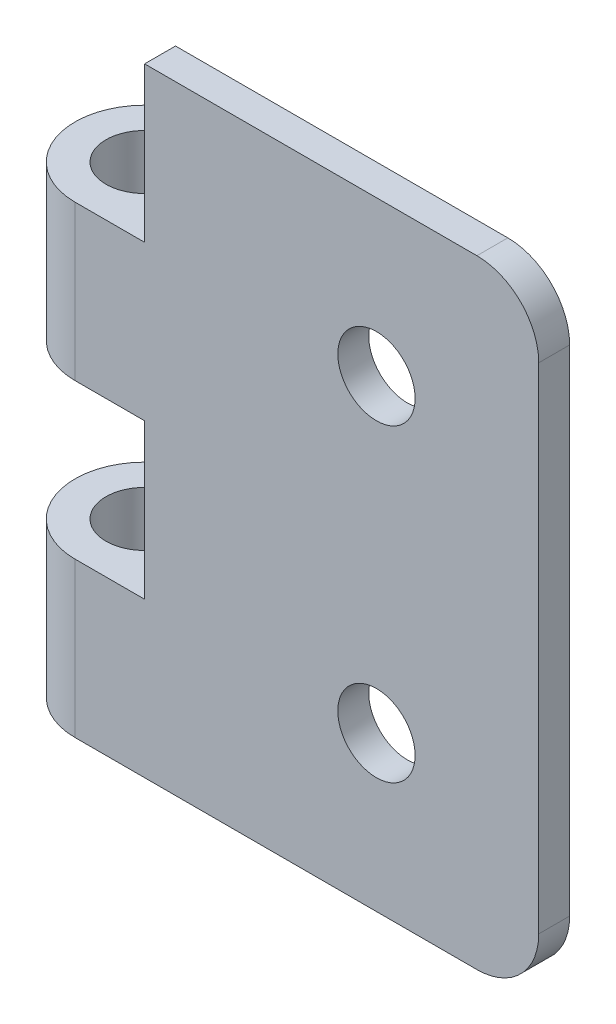
ISO-10303-21;
HEADER;
FILE_DESCRIPTION(('STEP AP214'),'2;1');
FILE_NAME('part.step','',(''),(''),'','','');
FILE_SCHEMA(('AUTOMOTIVE_DESIGN { 1 0 10303 214 1 1 1 1 }'));
ENDSEC;
DATA;
#1=APPLICATION_CONTEXT('core data for automotive mechanical design processes');
#2=APPLICATION_PROTOCOL_DEFINITION('international standard','automotive_design',2000,#1);
#3=PRODUCT_CONTEXT('',#1,'mechanical');
#4=PRODUCT('Part','Part','',(#3));
#5=PRODUCT_RELATED_PRODUCT_CATEGORY('part','',(#4));
#6=PRODUCT_DEFINITION_FORMATION('','',#4);
#7=PRODUCT_DEFINITION_CONTEXT('part definition',#1,'design');
#8=PRODUCT_DEFINITION('design','',#6,#7);
#9=PRODUCT_DEFINITION_SHAPE('','',#8);
#10=(LENGTH_UNIT() NAMED_UNIT(*) SI_UNIT(.MILLI.,.METRE.));
#11=(NAMED_UNIT(*) PLANE_ANGLE_UNIT() SI_UNIT($,.RADIAN.));
#12=(NAMED_UNIT(*) SI_UNIT($,.STERADIAN.) SOLID_ANGLE_UNIT());
#13=UNCERTAINTY_MEASURE_WITH_UNIT(LENGTH_MEASURE(1.E-05),#10,'distance_accuracy_value','');
#14=(GEOMETRIC_REPRESENTATION_CONTEXT(3) GLOBAL_UNCERTAINTY_ASSIGNED_CONTEXT((#13)) GLOBAL_UNIT_ASSIGNED_CONTEXT((#10,
#11,#12)) REPRESENTATION_CONTEXT('',''));
#15=CARTESIAN_POINT('',(0.,0.,0.));
#16=DIRECTION('',(0.,0.,1.));
#17=DIRECTION('',(1.,0.,0.));
#18=AXIS2_PLACEMENT_3D('',#15,#16,#17);
#19=CARTESIAN_POINT('',(0.,40.,0.));
#20=DIRECTION('',(0.,-1.,0.));
#21=DIRECTION('',(0.,0.,-1.));
#22=AXIS2_PLACEMENT_3D('',#19,#20,#21);
#23=CYLINDRICAL_SURFACE('',#22,4.5);
#24=CARTESIAN_POINT('',(0.,30.,0.));
#25=DIRECTION('',(0.,-1.,0.));
#26=DIRECTION('',(0.,0.,-1.));
#27=AXIS2_PLACEMENT_3D('',#24,#25,#26);
#28=CIRCLE('',#27,4.5);
#29=CARTESIAN_POINT('',(0.,30.,4.5));
#30=VERTEX_POINT('',#29);
#31=CARTESIAN_POINT('',(3.74165738677394,30.,2.5));
#32=VERTEX_POINT('',#31);
#33=EDGE_CURVE('E156',#30,#32,#28,.T.);
#34=ORIENTED_EDGE('',*,*,#33,.T.);
#35=DIRECTION('',(0.,-1.,0.));
#36=VECTOR('',#35,1.);
#37=CARTESIAN_POINT('',(3.74165738677394,40.,2.5));
#38=LINE('',#37,#36);
#39=CARTESIAN_POINT('',(3.74165738677394,20.,2.5));
#40=VERTEX_POINT('',#39);
#41=EDGE_CURVE('E189',#32,#40,#38,.T.);
#42=ORIENTED_EDGE('',*,*,#41,.T.);
#43=CARTESIAN_POINT('',(0.,20.,0.));
#44=DIRECTION('',(0.,1.,0.));
#45=DIRECTION('',(0.,0.,1.));
#46=AXIS2_PLACEMENT_3D('',#43,#44,#45);
#47=CIRCLE('',#46,4.5);
#48=CARTESIAN_POINT('',(0.,20.,4.5));
#49=VERTEX_POINT('',#48);
#50=EDGE_CURVE('E256',#40,#49,#47,.T.);
#51=ORIENTED_EDGE('',*,*,#50,.T.);
#52=DIRECTION('',(0.,-1.,0.));
#53=VECTOR('',#52,1.);
#54=CARTESIAN_POINT('',(0.,40.,4.5));
#55=LINE('',#54,#53);
#56=EDGE_CURVE('E197',#30,#49,#55,.T.);
#57=ORIENTED_EDGE('',*,*,#56,.F.);
#58=EDGE_LOOP('',(#34,#42,#51,#57));
#59=FACE_BOUND('',#58,.T.);
#60=ADVANCED_FACE('F35',(#59),#23,.T.);
#61=CARTESIAN_POINT('',(0.,40.,0.));
#62=DIRECTION('',(0.,1.,0.));
#63=DIRECTION('',(0.,0.,1.));
#64=AXIS2_PLACEMENT_3D('',#61,#62,#63);
#65=PLANE('',#64);
#66=DIRECTION('',(1.,0.,0.));
#67=VECTOR('',#66,1.);
#68=CARTESIAN_POINT('',(0.,40.,4.5));
#69=LINE('',#68,#67);
#70=CARTESIAN_POINT('',(4.5,40.,4.5));
#71=VERTEX_POINT('',#70);
#72=CARTESIAN_POINT('',(26.,40.,4.5));
#73=VERTEX_POINT('',#72);
#74=EDGE_CURVE('E175',#71,#73,#69,.T.);
#75=ORIENTED_EDGE('',*,*,#74,.T.);
#76=DIRECTION('',(0.,0.,-1.));
#77=VECTOR('',#76,1.);
#78=CARTESIAN_POINT('',(26.,40.,2.5));
#79=LINE('',#78,#77);
#80=CARTESIAN_POINT('',(26.,40.,2.5));
#81=VERTEX_POINT('',#80);
#82=EDGE_CURVE('E214',#73,#81,#79,.T.);
#83=ORIENTED_EDGE('',*,*,#82,.T.);
#84=DIRECTION('',(-1.,0.,0.));
#85=VECTOR('',#84,1.);
#86=CARTESIAN_POINT('',(30.,40.,2.5));
#87=LINE('',#86,#85);
#88=CARTESIAN_POINT('',(4.5,40.,2.5));
#89=VERTEX_POINT('',#88);
#90=EDGE_CURVE('E178',#81,#89,#87,.T.);
#91=ORIENTED_EDGE('',*,*,#90,.T.);
#92=DIRECTION('',(0.,0.,-1.));
#93=VECTOR('',#92,1.);
#94=CARTESIAN_POINT('',(4.5,40.,22.5));
#95=LINE('',#94,#93);
#96=EDGE_CURVE('E202',#71,#89,#95,.T.);
#97=ORIENTED_EDGE('',*,*,#96,.F.);
#98=EDGE_LOOP('',(#75,#83,#91,#97));
#99=FACE_BOUND('',#98,.T.);
#100=ADVANCED_FACE('F233',(#99),#65,.T.);
#101=CARTESIAN_POINT('',(0.,0.,0.));
#102=DIRECTION('',(0.,1.,0.));
#103=DIRECTION('',(0.,0.,1.));
#104=AXIS2_PLACEMENT_3D('',#101,#102,#103);
#105=PLANE('',#104);
#106=DIRECTION('',(-1.,0.,0.));
#107=VECTOR('',#106,1.);
#108=CARTESIAN_POINT('',(30.,0.,2.5));
#109=LINE('',#108,#107);
#110=CARTESIAN_POINT('',(26.,0.,2.5));
#111=VERTEX_POINT('',#110);
#112=CARTESIAN_POINT('',(3.74165738677394,0.,2.5));
#113=VERTEX_POINT('',#112);
#114=EDGE_CURVE('E179',#111,#113,#109,.T.);
#115=ORIENTED_EDGE('',*,*,#114,.F.);
#116=DIRECTION('',(0.,0.,-1.));
#117=VECTOR('',#116,1.);
#118=CARTESIAN_POINT('',(26.,0.,0.));
#119=LINE('',#118,#117);
#120=CARTESIAN_POINT('',(26.,0.,4.5));
#121=VERTEX_POINT('',#120);
#122=EDGE_CURVE('E11',#111,#121,#119,.F.);
#123=ORIENTED_EDGE('',*,*,#122,.T.);
#124=DIRECTION('',(1.,0.,0.));
#125=VECTOR('',#124,1.);
#126=CARTESIAN_POINT('',(0.,0.,4.5));
#127=LINE('',#126,#125);
#128=CARTESIAN_POINT('',(0.,0.,4.5));
#129=VERTEX_POINT('',#128);
#130=EDGE_CURVE('E184',#129,#121,#127,.T.);
#131=ORIENTED_EDGE('',*,*,#130,.F.);
#132=CARTESIAN_POINT('',(0.,0.,0.));
#133=DIRECTION('',(0.,1.,0.));
#134=DIRECTION('',(0.,0.,1.));
#135=AXIS2_PLACEMENT_3D('',#132,#133,#134);
#136=CIRCLE('',#135,4.5);
#137=EDGE_CURVE('E174',#113,#129,#136,.T.);
#138=ORIENTED_EDGE('',*,*,#137,.F.);
#139=EDGE_LOOP('',(#115,#123,#131,#138));
#140=FACE_BOUND('',#139,.T.);
#141=CARTESIAN_POINT('',(0.,0.,0.));
#142=DIRECTION('',(0.,1.,0.));
#143=DIRECTION('',(0.,0.,1.));
#144=AXIS2_PLACEMENT_3D('',#141,#142,#143);
#145=CIRCLE('',#144,2.5);
#146=CARTESIAN_POINT('',(0.,0.,2.5));
#147=VERTEX_POINT('',#146);
#148=EDGE_CURVE('E167',#147,#147,#145,.T.);
#149=ORIENTED_EDGE('',*,*,#148,.T.);
#150=EDGE_LOOP('',(#149));
#151=FACE_BOUND('',#150,.T.);
#152=ADVANCED_FACE('F246',(#140,#151),#105,.F.);
#153=CARTESIAN_POINT('',(0.,10.,0.));
#154=DIRECTION('',(0.,-1.,0.));
#155=DIRECTION('',(1.,0.,0.));
#156=AXIS2_PLACEMENT_3D('',#153,#154,#155);
#157=CIRCLE('',#156,4.5);
#158=CARTESIAN_POINT('',(0.,10.,4.5));
#159=VERTEX_POINT('',#158);
#160=CARTESIAN_POINT('',(3.74165738677394,10.,2.5));
#161=VERTEX_POINT('',#160);
#162=EDGE_CURVE('E130',#159,#161,#157,.T.);
#163=ORIENTED_EDGE('',*,*,#162,.T.);
#164=EDGE_CURVE('E181',#161,#113,#38,.T.);
#165=ORIENTED_EDGE('',*,*,#164,.T.);
#166=ORIENTED_EDGE('',*,*,#137,.T.);
#167=EDGE_CURVE('E195',#159,#129,#55,.T.);
#168=ORIENTED_EDGE('',*,*,#167,.F.);
#169=EDGE_LOOP('',(#163,#165,#166,#168));
#170=FACE_BOUND('',#169,.T.);
#171=ADVANCED_FACE('F249',(#170),#23,.T.);
#172=CARTESIAN_POINT('',(0.,40.,4.5));
#173=DIRECTION('',(0.,0.,-1.));
#174=DIRECTION('',(-1.,0.,0.));
#175=AXIS2_PLACEMENT_3D('',#172,#173,#174);
#176=PLANE('',#175);
#177=CARTESIAN_POINT('',(19.5,30.,4.5));
#178=DIRECTION('',(0.,0.,1.));
#179=DIRECTION('',(1.,0.,0.));
#180=AXIS2_PLACEMENT_3D('',#177,#178,#179);
#181=CIRCLE('',#180,2.5);
#182=CARTESIAN_POINT('',(22.,30.,4.5));
#183=VERTEX_POINT('',#182);
#184=EDGE_CURVE('E160',#183,#183,#181,.T.);
#185=ORIENTED_EDGE('',*,*,#184,.F.);
#186=EDGE_LOOP('',(#185));
#187=FACE_BOUND('',#186,.T.);
#188=CARTESIAN_POINT('',(19.5,10.,4.5));
#189=DIRECTION('',(0.,0.,1.));
#190=DIRECTION('',(-1.,0.,0.));
#191=AXIS2_PLACEMENT_3D('',#188,#189,#190);
#192=CIRCLE('',#191,2.5);
#193=CARTESIAN_POINT('',(17.,10.,4.5));
#194=VERTEX_POINT('',#193);
#195=EDGE_CURVE('E153',#194,#194,#192,.T.);
#196=ORIENTED_EDGE('',*,*,#195,.F.);
#197=EDGE_LOOP('',(#196));
#198=FACE_BOUND('',#197,.T.);
#199=DIRECTION('',(0.,-1.,0.));
#200=VECTOR('',#199,1.);
#201=CARTESIAN_POINT('',(30.,40.,4.5));
#202=LINE('',#201,#200);
#203=CARTESIAN_POINT('',(30.,36.,4.5));
#204=VERTEX_POINT('',#203);
#205=CARTESIAN_POINT('',(30.,4.,4.5));
#206=VERTEX_POINT('',#205);
#207=EDGE_CURVE('E193',#204,#206,#202,.T.);
#208=ORIENTED_EDGE('',*,*,#207,.F.);
#209=CARTESIAN_POINT('',(26.,36.,4.5));
#210=DIRECTION('',(0.,0.,-1.));
#211=DIRECTION('',(-1.,0.,0.));
#212=AXIS2_PLACEMENT_3D('',#209,#210,#211);
#213=CIRCLE('',#212,4.);
#214=EDGE_CURVE('E43',#204,#73,#213,.F.);
#215=ORIENTED_EDGE('',*,*,#214,.T.);
#216=ORIENTED_EDGE('',*,*,#74,.F.);
#217=DIRECTION('',(0.,-1.,0.));
#218=VECTOR('',#217,1.);
#219=CARTESIAN_POINT('',(4.5,40.,4.5));
#220=LINE('',#219,#218);
#221=CARTESIAN_POINT('',(4.5,30.,4.5));
#222=VERTEX_POINT('',#221);
#223=EDGE_CURVE('E149',#71,#222,#220,.T.);
#224=ORIENTED_EDGE('',*,*,#223,.T.);
#225=DIRECTION('',(-1.,0.,0.));
#226=VECTOR('',#225,1.);
#227=CARTESIAN_POINT('',(0.,30.,4.5));
#228=LINE('',#227,#226);
#229=EDGE_CURVE('E150',#222,#30,#228,.T.);
#230=ORIENTED_EDGE('',*,*,#229,.T.);
#231=ORIENTED_EDGE('',*,*,#56,.T.);
#232=DIRECTION('',(1.,0.,0.));
#233=VECTOR('',#232,1.);
#234=CARTESIAN_POINT('',(0.,20.,4.5));
#235=LINE('',#234,#233);
#236=CARTESIAN_POINT('',(4.5,20.,4.5));
#237=VERTEX_POINT('',#236);
#238=EDGE_CURVE('E148',#49,#237,#235,.T.);
#239=ORIENTED_EDGE('',*,*,#238,.T.);
#240=DIRECTION('',(0.,-1.,0.));
#241=VECTOR('',#240,1.);
#242=CARTESIAN_POINT('',(4.5,40.,4.5));
#243=LINE('',#242,#241);
#244=CARTESIAN_POINT('',(4.5,10.,4.5));
#245=VERTEX_POINT('',#244);
#246=EDGE_CURVE('E138',#237,#245,#243,.T.);
#247=ORIENTED_EDGE('',*,*,#246,.T.);
#248=DIRECTION('',(-1.,0.,0.));
#249=VECTOR('',#248,1.);
#250=CARTESIAN_POINT('',(0.,10.,4.5));
#251=LINE('',#250,#249);
#252=EDGE_CURVE('E124',#245,#159,#251,.T.);
#253=ORIENTED_EDGE('',*,*,#252,.T.);
#254=ORIENTED_EDGE('',*,*,#167,.T.);
#255=ORIENTED_EDGE('',*,*,#130,.T.);
#256=CARTESIAN_POINT('',(26.,4.,4.5));
#257=DIRECTION('',(0.,0.,-1.));
#258=DIRECTION('',(-1.,0.,0.));
#259=AXIS2_PLACEMENT_3D('',#256,#257,#258);
#260=CIRCLE('',#259,4.);
#261=EDGE_CURVE('E55',#121,#206,#260,.F.);
#262=ORIENTED_EDGE('',*,*,#261,.T.);
#263=EDGE_LOOP('',(#208,#215,#216,#224,#230,#231,#239,#247,#253,#254,#255,#262));
#264=FACE_BOUND('',#263,.T.);
#265=ADVANCED_FACE('F146',(#187,#198,#264),#176,.F.);
#266=CARTESIAN_POINT('',(30.,40.,4.5));
#267=DIRECTION('',(-1.,0.,0.));
#268=DIRECTION('',(0.,0.,1.));
#269=AXIS2_PLACEMENT_3D('',#266,#267,#268);
#270=PLANE('',#269);
#271=DIRECTION('',(0.,-1.,0.));
#272=VECTOR('',#271,1.);
#273=CARTESIAN_POINT('',(30.,40.,2.5));
#274=LINE('',#273,#272);
#275=CARTESIAN_POINT('',(30.,36.,2.5));
#276=VERTEX_POINT('',#275);
#277=CARTESIAN_POINT('',(30.,4.,2.5));
#278=VERTEX_POINT('',#277);
#279=EDGE_CURVE('E190',#276,#278,#274,.T.);
#280=ORIENTED_EDGE('',*,*,#279,.F.);
#281=DIRECTION('',(0.,0.,-1.));
#282=VECTOR('',#281,1.);
#283=CARTESIAN_POINT('',(30.,36.,4.5));
#284=LINE('',#283,#282);
#285=EDGE_CURVE('E224',#276,#204,#284,.F.);
#286=ORIENTED_EDGE('',*,*,#285,.T.);
#287=ORIENTED_EDGE('',*,*,#207,.T.);
#288=DIRECTION('',(0.,0.,-1.));
#289=VECTOR('',#288,1.);
#290=CARTESIAN_POINT('',(30.,4.,4.5));
#291=LINE('',#290,#289);
#292=EDGE_CURVE('E221',#206,#278,#291,.T.);
#293=ORIENTED_EDGE('',*,*,#292,.T.);
#294=EDGE_LOOP('',(#280,#286,#287,#293));
#295=FACE_BOUND('',#294,.T.);
#296=ADVANCED_FACE('F241',(#295),#270,.F.);
#297=CARTESIAN_POINT('',(30.,40.,2.5));
#298=DIRECTION('',(0.,0.,1.));
#299=DIRECTION('',(1.,0.,0.));
#300=AXIS2_PLACEMENT_3D('',#297,#298,#299);
#301=PLANE('',#300);
#302=CARTESIAN_POINT('',(19.5,30.,2.5));
#303=DIRECTION('',(0.,0.,1.));
#304=DIRECTION('',(1.,0.,0.));
#305=AXIS2_PLACEMENT_3D('',#302,#303,#304);
#306=CIRCLE('',#305,2.5);
#307=CARTESIAN_POINT('',(22.,30.,2.5));
#308=VERTEX_POINT('',#307);
#309=EDGE_CURVE('E163',#308,#308,#306,.F.);
#310=ORIENTED_EDGE('',*,*,#309,.F.);
#311=EDGE_LOOP('',(#310));
#312=FACE_BOUND('',#311,.T.);
#313=CARTESIAN_POINT('',(19.5,10.,2.5));
#314=DIRECTION('',(0.,0.,1.));
#315=DIRECTION('',(1.,0.,0.));
#316=AXIS2_PLACEMENT_3D('',#313,#314,#315);
#317=CIRCLE('',#316,2.5);
#318=CARTESIAN_POINT('',(22.,10.,2.5));
#319=VERTEX_POINT('',#318);
#320=EDGE_CURVE('E164',#319,#319,#317,.F.);
#321=ORIENTED_EDGE('',*,*,#320,.F.);
#322=EDGE_LOOP('',(#321));
#323=FACE_BOUND('',#322,.T.);
#324=ORIENTED_EDGE('',*,*,#90,.F.);
#325=CARTESIAN_POINT('',(26.,36.,2.5));
#326=DIRECTION('',(0.,0.,1.));
#327=DIRECTION('',(1.,0.,0.));
#328=AXIS2_PLACEMENT_3D('',#325,#326,#327);
#329=CIRCLE('',#328,4.);
#330=EDGE_CURVE('E219',#81,#276,#329,.F.);
#331=ORIENTED_EDGE('',*,*,#330,.T.);
#332=ORIENTED_EDGE('',*,*,#279,.T.);
#333=CARTESIAN_POINT('',(26.,4.,2.5));
#334=DIRECTION('',(0.,0.,1.));
#335=DIRECTION('',(1.,0.,0.));
#336=AXIS2_PLACEMENT_3D('',#333,#334,#335);
#337=CIRCLE('',#336,4.);
#338=EDGE_CURVE('E217',#278,#111,#337,.F.);
#339=ORIENTED_EDGE('',*,*,#338,.T.);
#340=ORIENTED_EDGE('',*,*,#114,.T.);
#341=ORIENTED_EDGE('',*,*,#164,.F.);
#342=DIRECTION('',(1.,0.,0.));
#343=VECTOR('',#342,1.);
#344=CARTESIAN_POINT('',(30.,10.,2.5));
#345=LINE('',#344,#343);
#346=CARTESIAN_POINT('',(4.5,10.,2.5));
#347=VERTEX_POINT('',#346);
#348=EDGE_CURVE('E201',#161,#347,#345,.T.);
#349=ORIENTED_EDGE('',*,*,#348,.T.);
#350=DIRECTION('',(0.,1.,0.));
#351=VECTOR('',#350,1.);
#352=CARTESIAN_POINT('',(4.5,40.,2.5));
#353=LINE('',#352,#351);
#354=CARTESIAN_POINT('',(4.5,20.,2.5));
#355=VERTEX_POINT('',#354);
#356=EDGE_CURVE('E141',#347,#355,#353,.T.);
#357=ORIENTED_EDGE('',*,*,#356,.T.);
#358=DIRECTION('',(-1.,0.,0.));
#359=VECTOR('',#358,1.);
#360=CARTESIAN_POINT('',(30.,20.,2.5));
#361=LINE('',#360,#359);
#362=EDGE_CURVE('E205',#355,#40,#361,.T.);
#363=ORIENTED_EDGE('',*,*,#362,.T.);
#364=ORIENTED_EDGE('',*,*,#41,.F.);
#365=DIRECTION('',(1.,0.,0.));
#366=VECTOR('',#365,1.);
#367=CARTESIAN_POINT('',(30.,30.,2.5));
#368=LINE('',#367,#366);
#369=CARTESIAN_POINT('',(4.5,30.,2.5));
#370=VERTEX_POINT('',#369);
#371=EDGE_CURVE('E209',#32,#370,#368,.T.);
#372=ORIENTED_EDGE('',*,*,#371,.T.);
#373=DIRECTION('',(0.,1.,0.));
#374=VECTOR('',#373,1.);
#375=CARTESIAN_POINT('',(4.5,40.,2.5));
#376=LINE('',#375,#374);
#377=EDGE_CURVE('E211',#370,#89,#376,.T.);
#378=ORIENTED_EDGE('',*,*,#377,.T.);
#379=EDGE_LOOP('',(#324,#331,#332,#339,#340,#341,#349,#357,#363,#364,#372,#378));
#380=FACE_BOUND('',#379,.T.);
#381=ADVANCED_FACE('F239',(#312,#323,#380),#301,.F.);
#382=CARTESIAN_POINT('',(0.,40.,0.));
#383=DIRECTION('',(0.,-1.,0.));
#384=DIRECTION('',(0.,0.,-1.));
#385=AXIS2_PLACEMENT_3D('',#382,#383,#384);
#386=CYLINDRICAL_SURFACE('',#385,2.5);
#387=CARTESIAN_POINT('',(0.,10.,0.));
#388=DIRECTION('',(0.,-1.,0.));
#389=DIRECTION('',(1.,0.,0.));
#390=AXIS2_PLACEMENT_3D('',#387,#388,#389);
#391=CIRCLE('',#390,2.5);
#392=CARTESIAN_POINT('',(2.5,10.,0.));
#393=VERTEX_POINT('',#392);
#394=EDGE_CURVE('E198',#393,#393,#391,.T.);
#395=ORIENTED_EDGE('',*,*,#394,.F.);
#396=EDGE_LOOP('',(#395));
#397=FACE_BOUND('',#396,.T.);
#398=ORIENTED_EDGE('',*,*,#148,.F.);
#399=EDGE_LOOP('',(#398));
#400=FACE_BOUND('',#399,.T.);
#401=ADVANCED_FACE('F288',(#397,#400),#386,.F.);
#402=CARTESIAN_POINT('',(19.5,10.,-4.501));
#403=DIRECTION('',(0.,0.,1.));
#404=DIRECTION('',(1.,0.,0.));
#405=AXIS2_PLACEMENT_3D('',#402,#403,#404);
#406=CYLINDRICAL_SURFACE('',#405,2.5);
#407=ORIENTED_EDGE('',*,*,#195,.T.);
#408=EDGE_LOOP('',(#407));
#409=FACE_BOUND('',#408,.T.);
#410=ORIENTED_EDGE('',*,*,#320,.T.);
#411=EDGE_LOOP('',(#410));
#412=FACE_BOUND('',#411,.T.);
#413=ADVANCED_FACE('F326',(#409,#412),#406,.F.);
#414=CARTESIAN_POINT('',(19.5,30.,-4.501));
#415=DIRECTION('',(0.,0.,1.));
#416=DIRECTION('',(1.,0.,0.));
#417=AXIS2_PLACEMENT_3D('',#414,#415,#416);
#418=CYLINDRICAL_SURFACE('',#417,2.5);
#419=ORIENTED_EDGE('',*,*,#184,.T.);
#420=EDGE_LOOP('',(#419));
#421=FACE_BOUND('',#420,.T.);
#422=ORIENTED_EDGE('',*,*,#309,.T.);
#423=EDGE_LOOP('',(#422));
#424=FACE_BOUND('',#423,.T.);
#425=ADVANCED_FACE('F334',(#421,#424),#418,.F.);
#426=CARTESIAN_POINT('',(4.5,20.,22.5));
#427=DIRECTION('',(1.,0.,0.));
#428=DIRECTION('',(0.,1.,0.));
#429=AXIS2_PLACEMENT_3D('',#426,#427,#428);
#430=PLANE('',#429);
#431=DIRECTION('',(0.,0.,-1.));
#432=VECTOR('',#431,1.);
#433=CARTESIAN_POINT('',(4.5,20.,22.5));
#434=LINE('',#433,#432);
#435=EDGE_CURVE('E143',#237,#355,#434,.T.);
#436=ORIENTED_EDGE('',*,*,#435,.T.);
#437=ORIENTED_EDGE('',*,*,#356,.F.);
#438=DIRECTION('',(0.,0.,-1.));
#439=VECTOR('',#438,1.);
#440=CARTESIAN_POINT('',(4.5,10.,22.5));
#441=LINE('',#440,#439);
#442=EDGE_CURVE('E128',#245,#347,#441,.T.);
#443=ORIENTED_EDGE('',*,*,#442,.F.);
#444=ORIENTED_EDGE('',*,*,#246,.F.);
#445=EDGE_LOOP('',(#436,#437,#443,#444));
#446=FACE_BOUND('',#445,.T.);
#447=ADVANCED_FACE('F137',(#446),#430,.F.);
#448=CARTESIAN_POINT('',(4.5,20.,22.5));
#449=DIRECTION('',(0.,1.,0.));
#450=DIRECTION('',(0.,0.,1.));
#451=AXIS2_PLACEMENT_3D('',#448,#449,#450);
#452=PLANE('',#451);
#453=CARTESIAN_POINT('',(0.,20.,0.));
#454=DIRECTION('',(0.,1.,0.));
#455=DIRECTION('',(0.,0.,1.));
#456=AXIS2_PLACEMENT_3D('',#453,#454,#455);
#457=CIRCLE('',#456,2.5);
#458=CARTESIAN_POINT('',(0.,20.,2.5));
#459=VERTEX_POINT('',#458);
#460=EDGE_CURVE('E133',#459,#459,#457,.T.);
#461=ORIENTED_EDGE('',*,*,#460,.T.);
#462=EDGE_LOOP('',(#461));
#463=FACE_BOUND('',#462,.T.);
#464=ORIENTED_EDGE('',*,*,#50,.F.);
#465=ORIENTED_EDGE('',*,*,#362,.F.);
#466=ORIENTED_EDGE('',*,*,#435,.F.);
#467=ORIENTED_EDGE('',*,*,#238,.F.);
#468=EDGE_LOOP('',(#464,#465,#466,#467));
#469=FACE_BOUND('',#468,.T.);
#470=ADVANCED_FACE('F272',(#463,#469),#452,.F.);
#471=CARTESIAN_POINT('',(4.5,10.,22.5));
#472=DIRECTION('',(0.,-1.,0.));
#473=DIRECTION('',(1.,0.,0.));
#474=AXIS2_PLACEMENT_3D('',#471,#472,#473);
#475=PLANE('',#474);
#476=ORIENTED_EDGE('',*,*,#394,.T.);
#477=EDGE_LOOP('',(#476));
#478=FACE_BOUND('',#477,.T.);
#479=ORIENTED_EDGE('',*,*,#442,.T.);
#480=ORIENTED_EDGE('',*,*,#348,.F.);
#481=ORIENTED_EDGE('',*,*,#162,.F.);
#482=ORIENTED_EDGE('',*,*,#252,.F.);
#483=EDGE_LOOP('',(#479,#480,#481,#482));
#484=FACE_BOUND('',#483,.T.);
#485=ADVANCED_FACE('F126',(#478,#484),#475,.F.);
#486=CARTESIAN_POINT('',(0.,30.,0.));
#487=DIRECTION('',(0.,-1.,0.));
#488=DIRECTION('',(0.,0.,-1.));
#489=AXIS2_PLACEMENT_3D('',#486,#487,#488);
#490=CIRCLE('',#489,2.5);
#491=CARTESIAN_POINT('',(0.,30.,-2.5));
#492=VERTEX_POINT('',#491);
#493=EDGE_CURVE('E206',#492,#492,#490,.T.);
#494=ORIENTED_EDGE('',*,*,#493,.F.);
#495=EDGE_LOOP('',(#494));
#496=FACE_BOUND('',#495,.T.);
#497=ORIENTED_EDGE('',*,*,#460,.F.);
#498=EDGE_LOOP('',(#497));
#499=FACE_BOUND('',#498,.T.);
#500=ADVANCED_FACE('F278',(#496,#499),#386,.F.);
#501=CARTESIAN_POINT('',(4.5,40.,22.5));
#502=DIRECTION('',(1.,0.,0.));
#503=DIRECTION('',(0.,1.,0.));
#504=AXIS2_PLACEMENT_3D('',#501,#502,#503);
#505=PLANE('',#504);
#506=ORIENTED_EDGE('',*,*,#96,.T.);
#507=ORIENTED_EDGE('',*,*,#377,.F.);
#508=DIRECTION('',(0.,0.,-1.));
#509=VECTOR('',#508,1.);
#510=CARTESIAN_POINT('',(4.5,30.,22.5));
#511=LINE('',#510,#509);
#512=EDGE_CURVE('E269',#222,#370,#511,.T.);
#513=ORIENTED_EDGE('',*,*,#512,.F.);
#514=ORIENTED_EDGE('',*,*,#223,.F.);
#515=EDGE_LOOP('',(#506,#507,#513,#514));
#516=FACE_BOUND('',#515,.T.);
#517=ADVANCED_FACE('F276',(#516),#505,.F.);
#518=CARTESIAN_POINT('',(4.5,30.,22.5));
#519=DIRECTION('',(0.,-1.,0.));
#520=DIRECTION('',(0.,0.,-1.));
#521=AXIS2_PLACEMENT_3D('',#518,#519,#520);
#522=PLANE('',#521);
#523=ORIENTED_EDGE('',*,*,#493,.T.);
#524=EDGE_LOOP('',(#523));
#525=FACE_BOUND('',#524,.T.);
#526=ORIENTED_EDGE('',*,*,#512,.T.);
#527=ORIENTED_EDGE('',*,*,#371,.F.);
#528=ORIENTED_EDGE('',*,*,#33,.F.);
#529=ORIENTED_EDGE('',*,*,#229,.F.);
#530=EDGE_LOOP('',(#526,#527,#528,#529));
#531=FACE_BOUND('',#530,.T.);
#532=ADVANCED_FACE('F267',(#525,#531),#522,.F.);
#533=CARTESIAN_POINT('',(26.,36.,0.));
#534=DIRECTION('',(0.,0.,1.));
#535=DIRECTION('',(1.,0.,0.));
#536=AXIS2_PLACEMENT_3D('',#533,#534,#535);
#537=CYLINDRICAL_SURFACE('',#536,4.);
#538=ORIENTED_EDGE('',*,*,#214,.F.);
#539=ORIENTED_EDGE('',*,*,#285,.F.);
#540=ORIENTED_EDGE('',*,*,#330,.F.);
#541=ORIENTED_EDGE('',*,*,#82,.F.);
#542=EDGE_LOOP('',(#538,#539,#540,#541));
#543=FACE_BOUND('',#542,.T.);
#544=ADVANCED_FACE('F236',(#543),#537,.T.);
#545=CARTESIAN_POINT('',(26.,4.,4.5));
#546=DIRECTION('',(0.,0.,-1.));
#547=DIRECTION('',(-1.,0.,0.));
#548=AXIS2_PLACEMENT_3D('',#545,#546,#547);
#549=CYLINDRICAL_SURFACE('',#548,4.);
#550=ORIENTED_EDGE('',*,*,#261,.F.);
#551=ORIENTED_EDGE('',*,*,#122,.F.);
#552=ORIENTED_EDGE('',*,*,#338,.F.);
#553=ORIENTED_EDGE('',*,*,#292,.F.);
#554=EDGE_LOOP('',(#550,#551,#552,#553));
#555=FACE_BOUND('',#554,.T.);
#556=ADVANCED_FACE('F37',(#555),#549,.T.);
#557=CLOSED_SHELL('',(#60,#100,#152,#171,#265,#296,#381,#401,#413,#425,#447,#470,#485,#500,#517,
#532,#544,#556));
#558=MANIFOLD_SOLID_BREP('B2',#557);
#559=ADVANCED_BREP_SHAPE_REPRESENTATION('',(#18,#558),#14);
#560=SHAPE_DEFINITION_REPRESENTATION(#9,#559);
ENDSEC;
END-ISO-10303-21;
